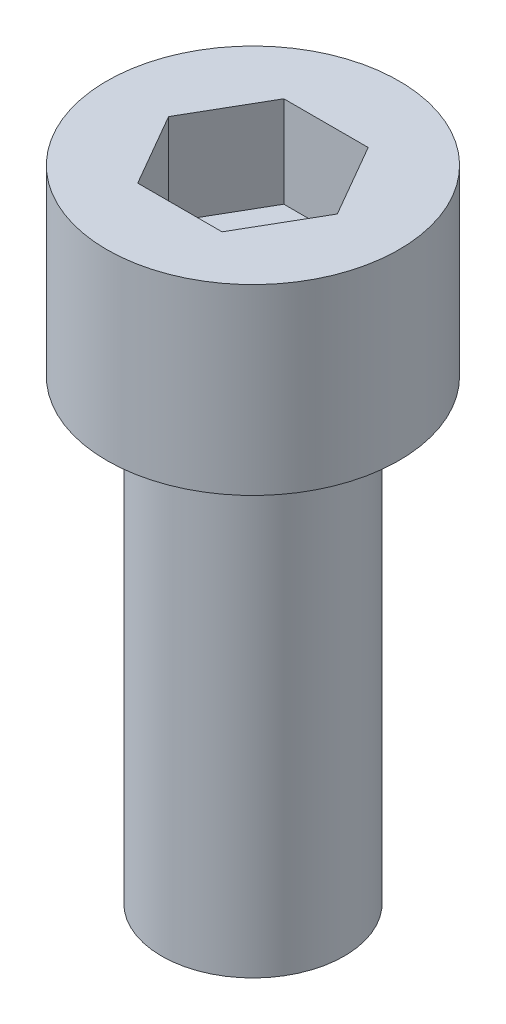
ISO-10303-21;
HEADER;
FILE_DESCRIPTION(('STEP AP214'),'2;1');
FILE_NAME('part.step','',(''),(''),'','','');
FILE_SCHEMA(('AUTOMOTIVE_DESIGN { 1 0 10303 214 1 1 1 1 }'));
ENDSEC;
DATA;
#1=APPLICATION_CONTEXT('core data for automotive mechanical design processes');
#2=APPLICATION_PROTOCOL_DEFINITION('international standard','automotive_design',2000,#1);
#3=PRODUCT_CONTEXT('',#1,'mechanical');
#4=PRODUCT('Part','Part','',(#3));
#5=PRODUCT_RELATED_PRODUCT_CATEGORY('part','',(#4));
#6=PRODUCT_DEFINITION_FORMATION('','',#4);
#7=PRODUCT_DEFINITION_CONTEXT('part definition',#1,'design');
#8=PRODUCT_DEFINITION('design','',#6,#7);
#9=PRODUCT_DEFINITION_SHAPE('','',#8);
#10=(LENGTH_UNIT() NAMED_UNIT(*) SI_UNIT(.MILLI.,.METRE.));
#11=(NAMED_UNIT(*) PLANE_ANGLE_UNIT() SI_UNIT($,.RADIAN.));
#12=(NAMED_UNIT(*) SI_UNIT($,.STERADIAN.) SOLID_ANGLE_UNIT());
#13=UNCERTAINTY_MEASURE_WITH_UNIT(LENGTH_MEASURE(1.E-05),#10,'distance_accuracy_value','');
#14=(GEOMETRIC_REPRESENTATION_CONTEXT(3) GLOBAL_UNCERTAINTY_ASSIGNED_CONTEXT((#13)) GLOBAL_UNIT_ASSIGNED_CONTEXT((#10,
#11,#12)) REPRESENTATION_CONTEXT('',''));
#15=CARTESIAN_POINT('',(0.,0.,0.));
#16=DIRECTION('',(0.,0.,1.));
#17=DIRECTION('',(1.,0.,0.));
#18=AXIS2_PLACEMENT_3D('',#15,#16,#17);
#19=CARTESIAN_POINT('',(5.00000000000001,0.,0.));
#20=DIRECTION('',(0.,1.,0.));
#21=DIRECTION('',(0.,0.,1.));
#22=AXIS2_PLACEMENT_3D('',#19,#20,#21);
#23=PLANE('',#22);
#24=CARTESIAN_POINT('',(0.,0.,0.));
#25=DIRECTION('',(0.,1.,0.));
#26=DIRECTION('',(0.,0.,1.));
#27=AXIS2_PLACEMENT_3D('',#24,#25,#26);
#28=CIRCLE('',#27,8.00000000000001);
#29=CARTESIAN_POINT('',(0.,0.,8.00000000000001));
#30=VERTEX_POINT('',#29);
#31=EDGE_CURVE('E144',#30,#30,#28,.T.);
#32=ORIENTED_EDGE('',*,*,#31,.F.);
#33=EDGE_LOOP('',(#32));
#34=FACE_BOUND('',#33,.T.);
#35=CARTESIAN_POINT('',(0.,0.,0.));
#36=DIRECTION('',(0.,1.,0.));
#37=DIRECTION('',(0.,0.,1.));
#38=AXIS2_PLACEMENT_3D('',#35,#36,#37);
#39=CIRCLE('',#38,5.5);
#40=CARTESIAN_POINT('',(0.,0.,5.5));
#41=VERTEX_POINT('',#40);
#42=EDGE_CURVE('E12',#41,#41,#39,.F.);
#43=ORIENTED_EDGE('',*,*,#42,.F.);
#44=EDGE_LOOP('',(#43));
#45=FACE_BOUND('',#44,.T.);
#46=ADVANCED_FACE('F33',(#34,#45),#23,.F.);
#47=CARTESIAN_POINT('',(8.00000000000001,10.,0.));
#48=DIRECTION('',(0.,-1.,0.));
#49=DIRECTION('',(0.,0.,-1.));
#50=AXIS2_PLACEMENT_3D('',#47,#48,#49);
#51=PLANE('',#50);
#52=DIRECTION('',(-1.,0.,0.));
#53=VECTOR('',#52,1.);
#54=CARTESIAN_POINT('',(2.3094010767585,10.,-4.));
#55=LINE('',#54,#53);
#56=CARTESIAN_POINT('',(2.3094010767585,10.,-4.));
#57=VERTEX_POINT('',#56);
#58=CARTESIAN_POINT('',(-2.3094010767585,10.,-4.));
#59=VERTEX_POINT('',#58);
#60=EDGE_CURVE('E122',#57,#59,#55,.T.);
#61=ORIENTED_EDGE('',*,*,#60,.F.);
#62=DIRECTION('',(-0.5,0.,-0.866025403784439));
#63=VECTOR('',#62,1.);
#64=CARTESIAN_POINT('',(4.61880215351701,10.,0.));
#65=LINE('',#64,#63);
#66=CARTESIAN_POINT('',(4.61880215351701,10.,0.));
#67=VERTEX_POINT('',#66);
#68=EDGE_CURVE('E48',#67,#57,#65,.T.);
#69=ORIENTED_EDGE('',*,*,#68,.F.);
#70=DIRECTION('',(0.5,0.,-0.866025403784439));
#71=VECTOR('',#70,1.);
#72=CARTESIAN_POINT('',(2.3094010767585,10.,4.));
#73=LINE('',#72,#71);
#74=CARTESIAN_POINT('',(2.3094010767585,10.,4.));
#75=VERTEX_POINT('',#74);
#76=EDGE_CURVE('E132',#75,#67,#73,.T.);
#77=ORIENTED_EDGE('',*,*,#76,.F.);
#78=DIRECTION('',(1.,0.,0.));
#79=VECTOR('',#78,1.);
#80=CARTESIAN_POINT('',(-2.3094010767585,10.,4.));
#81=LINE('',#80,#79);
#82=CARTESIAN_POINT('',(-2.3094010767585,10.,4.));
#83=VERTEX_POINT('',#82);
#84=EDGE_CURVE('E130',#83,#75,#81,.T.);
#85=ORIENTED_EDGE('',*,*,#84,.F.);
#86=DIRECTION('',(0.5,0.,0.866025403784438));
#87=VECTOR('',#86,1.);
#88=CARTESIAN_POINT('',(-4.61880215351701,10.,0.));
#89=LINE('',#88,#87);
#90=CARTESIAN_POINT('',(-4.61880215351701,10.,0.));
#91=VERTEX_POINT('',#90);
#92=EDGE_CURVE('E96',#91,#83,#89,.T.);
#93=ORIENTED_EDGE('',*,*,#92,.F.);
#94=DIRECTION('',(-0.5,0.,0.866025403784439));
#95=VECTOR('',#94,1.);
#96=CARTESIAN_POINT('',(-2.3094010767585,10.,-4.));
#97=LINE('',#96,#95);
#98=EDGE_CURVE('E126',#59,#91,#97,.T.);
#99=ORIENTED_EDGE('',*,*,#98,.F.);
#100=EDGE_LOOP('',(#61,#69,#77,#85,#93,#99));
#101=FACE_BOUND('',#100,.T.);
#102=CARTESIAN_POINT('',(0.,10.,0.));
#103=DIRECTION('',(0.,1.,0.));
#104=DIRECTION('',(0.,0.,1.));
#105=AXIS2_PLACEMENT_3D('',#102,#103,#104);
#106=CIRCLE('',#105,8.00000000000001);
#107=CARTESIAN_POINT('',(0.,10.,8.00000000000001));
#108=VERTEX_POINT('',#107);
#109=EDGE_CURVE('E147',#108,#108,#106,.T.);
#110=ORIENTED_EDGE('',*,*,#109,.T.);
#111=EDGE_LOOP('',(#110));
#112=FACE_BOUND('',#111,.T.);
#113=ADVANCED_FACE('F35',(#101,#112),#51,.F.);
#114=CARTESIAN_POINT('',(0.,61.6916426261037,0.));
#115=DIRECTION('',(0.,1.,0.));
#116=DIRECTION('',(0.,0.,1.));
#117=AXIS2_PLACEMENT_3D('',#114,#115,#116);
#118=CYLINDRICAL_SURFACE('',#117,8.00000000000001);
#119=ORIENTED_EDGE('',*,*,#109,.F.);
#120=EDGE_LOOP('',(#119));
#121=FACE_BOUND('',#120,.T.);
#122=ORIENTED_EDGE('',*,*,#31,.T.);
#123=EDGE_LOOP('',(#122));
#124=FACE_BOUND('',#123,.T.);
#125=ADVANCED_FACE('F171',(#121,#124),#118,.T.);
#126=CARTESIAN_POINT('',(4.61880215351701,5.,0.));
#127=DIRECTION('',(0.866025403784439,0.,-0.5));
#128=DIRECTION('',(-0.5,0.,-0.866025403784439));
#129=AXIS2_PLACEMENT_3D('',#126,#127,#128);
#130=PLANE('',#129);
#131=ORIENTED_EDGE('',*,*,#68,.T.);
#132=DIRECTION('',(0.,1.,0.));
#133=VECTOR('',#132,1.);
#134=CARTESIAN_POINT('',(2.3094010767585,5.,-4.));
#135=LINE('',#134,#133);
#136=CARTESIAN_POINT('',(2.3094010767585,5.,-4.));
#137=VERTEX_POINT('',#136);
#138=EDGE_CURVE('E78',#137,#57,#135,.T.);
#139=ORIENTED_EDGE('',*,*,#138,.F.);
#140=DIRECTION('',(-0.5,0.,-0.866025403784439));
#141=VECTOR('',#140,1.);
#142=CARTESIAN_POINT('',(4.61880215351701,5.,0.));
#143=LINE('',#142,#141);
#144=CARTESIAN_POINT('',(4.61880215351701,5.,0.));
#145=VERTEX_POINT('',#144);
#146=EDGE_CURVE('E134',#145,#137,#143,.T.);
#147=ORIENTED_EDGE('',*,*,#146,.F.);
#148=DIRECTION('',(0.,1.,0.));
#149=VECTOR('',#148,1.);
#150=CARTESIAN_POINT('',(4.61880215351701,5.,0.));
#151=LINE('',#150,#149);
#152=EDGE_CURVE('E56',#145,#67,#151,.T.);
#153=ORIENTED_EDGE('',*,*,#152,.T.);
#154=EDGE_LOOP('',(#131,#139,#147,#153));
#155=FACE_BOUND('',#154,.T.);
#156=ADVANCED_FACE('F176',(#155),#130,.F.);
#157=CARTESIAN_POINT('',(2.3094010767585,5.,4.));
#158=DIRECTION('',(0.866025403784439,0.,0.5));
#159=DIRECTION('',(0.5,0.,-0.866025403784439));
#160=AXIS2_PLACEMENT_3D('',#157,#158,#159);
#161=PLANE('',#160);
#162=ORIENTED_EDGE('',*,*,#76,.T.);
#163=ORIENTED_EDGE('',*,*,#152,.F.);
#164=DIRECTION('',(0.5,0.,-0.866025403784439));
#165=VECTOR('',#164,1.);
#166=CARTESIAN_POINT('',(2.3094010767585,5.,4.));
#167=LINE('',#166,#165);
#168=CARTESIAN_POINT('',(2.3094010767585,5.,4.));
#169=VERTEX_POINT('',#168);
#170=EDGE_CURVE('E108',#169,#145,#167,.T.);
#171=ORIENTED_EDGE('',*,*,#170,.F.);
#172=DIRECTION('',(0.,1.,0.));
#173=VECTOR('',#172,1.);
#174=CARTESIAN_POINT('',(2.3094010767585,5.,4.));
#175=LINE('',#174,#173);
#176=EDGE_CURVE('E100',#169,#75,#175,.T.);
#177=ORIENTED_EDGE('',*,*,#176,.T.);
#178=EDGE_LOOP('',(#162,#163,#171,#177));
#179=FACE_BOUND('',#178,.T.);
#180=ADVANCED_FACE('F181',(#179),#161,.F.);
#181=CARTESIAN_POINT('',(-2.3094010767585,5.,4.));
#182=DIRECTION('',(0.,0.,1.));
#183=DIRECTION('',(1.,0.,0.));
#184=AXIS2_PLACEMENT_3D('',#181,#182,#183);
#185=PLANE('',#184);
#186=ORIENTED_EDGE('',*,*,#84,.T.);
#187=ORIENTED_EDGE('',*,*,#176,.F.);
#188=DIRECTION('',(1.,0.,0.));
#189=VECTOR('',#188,1.);
#190=CARTESIAN_POINT('',(-2.3094010767585,5.,4.));
#191=LINE('',#190,#189);
#192=CARTESIAN_POINT('',(-2.3094010767585,5.,4.));
#193=VERTEX_POINT('',#192);
#194=EDGE_CURVE('E104',#193,#169,#191,.T.);
#195=ORIENTED_EDGE('',*,*,#194,.F.);
#196=DIRECTION('',(0.,1.,0.));
#197=VECTOR('',#196,1.);
#198=CARTESIAN_POINT('',(-2.3094010767585,5.,4.));
#199=LINE('',#198,#197);
#200=EDGE_CURVE('E89',#193,#83,#199,.T.);
#201=ORIENTED_EDGE('',*,*,#200,.T.);
#202=EDGE_LOOP('',(#186,#187,#195,#201));
#203=FACE_BOUND('',#202,.T.);
#204=ADVANCED_FACE('F105',(#203),#185,.F.);
#205=CARTESIAN_POINT('',(-4.61880215351701,5.,0.));
#206=DIRECTION('',(-0.866025403784438,0.,0.5));
#207=DIRECTION('',(0.5,0.,0.866025403784439));
#208=AXIS2_PLACEMENT_3D('',#205,#206,#207);
#209=PLANE('',#208);
#210=ORIENTED_EDGE('',*,*,#92,.T.);
#211=ORIENTED_EDGE('',*,*,#200,.F.);
#212=DIRECTION('',(0.5,0.,0.866025403784438));
#213=VECTOR('',#212,1.);
#214=CARTESIAN_POINT('',(-4.61880215351701,5.,0.));
#215=LINE('',#214,#213);
#216=CARTESIAN_POINT('',(-4.61880215351701,5.,0.));
#217=VERTEX_POINT('',#216);
#218=EDGE_CURVE('E93',#217,#193,#215,.T.);
#219=ORIENTED_EDGE('',*,*,#218,.F.);
#220=DIRECTION('',(0.,1.,0.));
#221=VECTOR('',#220,1.);
#222=CARTESIAN_POINT('',(-4.61880215351701,5.,0.));
#223=LINE('',#222,#221);
#224=EDGE_CURVE('E101',#217,#91,#223,.T.);
#225=ORIENTED_EDGE('',*,*,#224,.T.);
#226=EDGE_LOOP('',(#210,#211,#219,#225));
#227=FACE_BOUND('',#226,.T.);
#228=ADVANCED_FACE('F91',(#227),#209,.F.);
#229=CARTESIAN_POINT('',(-2.3094010767585,5.,-4.));
#230=DIRECTION('',(-0.866025403784439,0.,-0.5));
#231=DIRECTION('',(-0.5,0.,0.866025403784439));
#232=AXIS2_PLACEMENT_3D('',#229,#230,#231);
#233=PLANE('',#232);
#234=ORIENTED_EDGE('',*,*,#98,.T.);
#235=ORIENTED_EDGE('',*,*,#224,.F.);
#236=DIRECTION('',(-0.5,0.,0.866025403784439));
#237=VECTOR('',#236,1.);
#238=CARTESIAN_POINT('',(-2.3094010767585,5.,-4.));
#239=LINE('',#238,#237);
#240=CARTESIAN_POINT('',(-2.3094010767585,5.,-4.));
#241=VERTEX_POINT('',#240);
#242=EDGE_CURVE('E114',#241,#217,#239,.T.);
#243=ORIENTED_EDGE('',*,*,#242,.F.);
#244=DIRECTION('',(0.,1.,0.));
#245=VECTOR('',#244,1.);
#246=CARTESIAN_POINT('',(-2.3094010767585,5.,-4.));
#247=LINE('',#246,#245);
#248=EDGE_CURVE('E139',#241,#59,#247,.T.);
#249=ORIENTED_EDGE('',*,*,#248,.T.);
#250=EDGE_LOOP('',(#234,#235,#243,#249));
#251=FACE_BOUND('',#250,.T.);
#252=ADVANCED_FACE('F194',(#251),#233,.F.);
#253=CARTESIAN_POINT('',(2.3094010767585,5.,-4.));
#254=DIRECTION('',(0.,0.,-1.));
#255=DIRECTION('',(-1.,0.,0.));
#256=AXIS2_PLACEMENT_3D('',#253,#254,#255);
#257=PLANE('',#256);
#258=ORIENTED_EDGE('',*,*,#60,.T.);
#259=ORIENTED_EDGE('',*,*,#248,.F.);
#260=DIRECTION('',(-1.,0.,0.));
#261=VECTOR('',#260,1.);
#262=CARTESIAN_POINT('',(2.3094010767585,5.,-4.));
#263=LINE('',#262,#261);
#264=EDGE_CURVE('E116',#137,#241,#263,.T.);
#265=ORIENTED_EDGE('',*,*,#264,.F.);
#266=ORIENTED_EDGE('',*,*,#138,.T.);
#267=EDGE_LOOP('',(#258,#259,#265,#266));
#268=FACE_BOUND('',#267,.T.);
#269=ADVANCED_FACE('F191',(#268),#257,.F.);
#270=CARTESIAN_POINT('',(0.,5.,-8.));
#271=DIRECTION('',(0.,1.,0.));
#272=DIRECTION('',(0.,0.,1.));
#273=AXIS2_PLACEMENT_3D('',#270,#271,#272);
#274=PLANE('',#273);
#275=ORIENTED_EDGE('',*,*,#146,.T.);
#276=ORIENTED_EDGE('',*,*,#264,.T.);
#277=ORIENTED_EDGE('',*,*,#242,.T.);
#278=ORIENTED_EDGE('',*,*,#218,.T.);
#279=ORIENTED_EDGE('',*,*,#194,.T.);
#280=ORIENTED_EDGE('',*,*,#170,.T.);
#281=EDGE_LOOP('',(#275,#276,#277,#278,#279,#280));
#282=FACE_BOUND('',#281,.T.);
#283=ADVANCED_FACE('F111',(#282),#274,.T.);
#284=CARTESIAN_POINT('',(0.,-4.93678143550133,0.));
#285=DIRECTION('',(0.,1.,0.));
#286=DIRECTION('',(0.,0.,1.));
#287=AXIS2_PLACEMENT_3D('',#284,#285,#286);
#288=CONICAL_SURFACE('',#287,0.,1.01229096615671);
#289=CARTESIAN_POINT('',(0.,-1.5,0.));
#290=DIRECTION('',(0.,1.,0.));
#291=DIRECTION('',(0.,0.,1.));
#292=AXIS2_PLACEMENT_3D('',#289,#290,#291);
#293=CIRCLE('',#292,5.5);
#294=CARTESIAN_POINT('',(0.,-1.5,5.5));
#295=VERTEX_POINT('',#294);
#296=EDGE_CURVE('E123',#295,#295,#293,.T.);
#297=ORIENTED_EDGE('',*,*,#296,.F.);
#298=EDGE_LOOP('',(#297));
#299=FACE_BOUND('',#298,.T.);
#300=CARTESIAN_POINT('',(0.,-1.81243467595466,0.));
#301=DIRECTION('',(0.,1.,0.));
#302=DIRECTION('',(0.,0.,1.));
#303=AXIS2_PLACEMENT_3D('',#300,#301,#302);
#304=CIRCLE('',#303,5.00000000000001);
#305=CARTESIAN_POINT('',(0.,-1.81243467595466,5.00000000000001));
#306=VERTEX_POINT('',#305);
#307=EDGE_CURVE('E41',#306,#306,#304,.T.);
#308=ORIENTED_EDGE('',*,*,#307,.T.);
#309=EDGE_LOOP('',(#308));
#310=FACE_BOUND('',#309,.T.);
#311=ADVANCED_FACE('F152',(#299,#310),#288,.T.);
#312=CARTESIAN_POINT('',(0.,0.,0.));
#313=DIRECTION('',(0.,1.,0.));
#314=DIRECTION('',(0.,0.,1.));
#315=AXIS2_PLACEMENT_3D('',#312,#313,#314);
#316=CYLINDRICAL_SURFACE('',#315,5.5);
#317=ORIENTED_EDGE('',*,*,#42,.T.);
#318=EDGE_LOOP('',(#317));
#319=FACE_BOUND('',#318,.T.);
#320=ORIENTED_EDGE('',*,*,#296,.T.);
#321=EDGE_LOOP('',(#320));
#322=FACE_BOUND('',#321,.T.);
#323=ADVANCED_FACE('F162',(#319,#322),#316,.T.);
#324=CARTESIAN_POINT('',(0.,-25.,0.));
#325=DIRECTION('',(0.,1.,0.));
#326=DIRECTION('',(0.,0.,1.));
#327=AXIS2_PLACEMENT_3D('',#324,#325,#326);
#328=PLANE('',#327);
#329=CARTESIAN_POINT('',(0.,-25.,0.));
#330=DIRECTION('',(0.,1.,0.));
#331=DIRECTION('',(0.,0.,1.));
#332=AXIS2_PLACEMENT_3D('',#329,#330,#331);
#333=CIRCLE('',#332,5.00000000000001);
#334=CARTESIAN_POINT('',(0.,-25.,5.00000000000001));
#335=VERTEX_POINT('',#334);
#336=EDGE_CURVE('E136',#335,#335,#333,.T.);
#337=ORIENTED_EDGE('',*,*,#336,.F.);
#338=EDGE_LOOP('',(#337));
#339=FACE_BOUND('',#338,.T.);
#340=ADVANCED_FACE('F156',(#339),#328,.F.);
#341=CARTESIAN_POINT('',(0.,61.6916426261037,0.));
#342=DIRECTION('',(0.,1.,0.));
#343=DIRECTION('',(0.,0.,1.));
#344=AXIS2_PLACEMENT_3D('',#341,#342,#343);
#345=CYLINDRICAL_SURFACE('',#344,5.00000000000001);
#346=ORIENTED_EDGE('',*,*,#336,.T.);
#347=EDGE_LOOP('',(#346));
#348=FACE_BOUND('',#347,.T.);
#349=ORIENTED_EDGE('',*,*,#307,.F.);
#350=EDGE_LOOP('',(#349));
#351=FACE_BOUND('',#350,.T.);
#352=ADVANCED_FACE('F154',(#348,#351),#345,.T.);
#353=CLOSED_SHELL('',(#46,#113,#125,#156,#180,#204,#228,#252,#269,#283,#311,#323,#340,#352));
#354=MANIFOLD_SOLID_BREP('B2',#353);
#355=ADVANCED_BREP_SHAPE_REPRESENTATION('',(#18,#354),#14);
#356=SHAPE_DEFINITION_REPRESENTATION(#9,#355);
ENDSEC;
END-ISO-10303-21;
